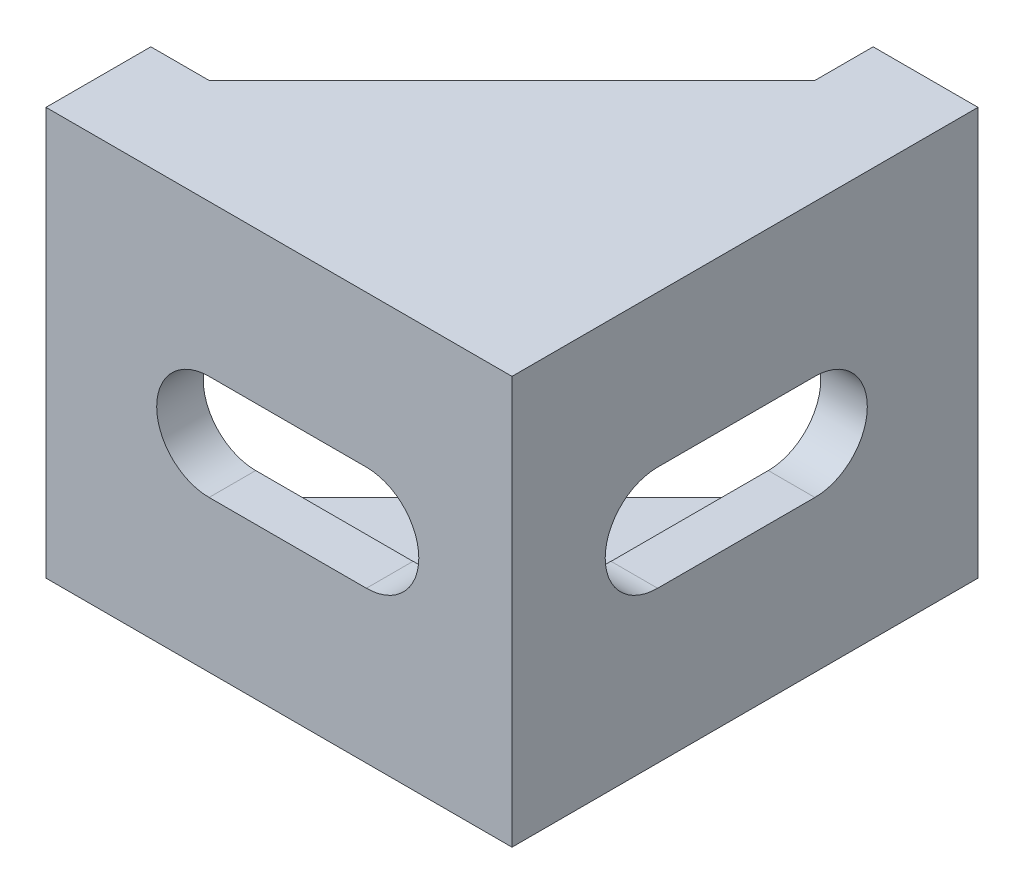
ISO-10303-21;
HEADER;
FILE_DESCRIPTION(('STEP AP214'),'2;1');
FILE_NAME('part.step','',(''),(''),'','','');
FILE_SCHEMA(('AUTOMOTIVE_DESIGN { 1 0 10303 214 1 1 1 1 }'));
ENDSEC;
DATA;
#1=APPLICATION_CONTEXT('core data for automotive mechanical design processes');
#2=APPLICATION_PROTOCOL_DEFINITION('international standard','automotive_design',2000,#1);
#3=PRODUCT_CONTEXT('',#1,'mechanical');
#4=PRODUCT('Part','Part','',(#3));
#5=PRODUCT_RELATED_PRODUCT_CATEGORY('part','',(#4));
#6=PRODUCT_DEFINITION_FORMATION('','',#4);
#7=PRODUCT_DEFINITION_CONTEXT('part definition',#1,'design');
#8=PRODUCT_DEFINITION('design','',#6,#7);
#9=PRODUCT_DEFINITION_SHAPE('','',#8);
#10=(LENGTH_UNIT() NAMED_UNIT(*) SI_UNIT(.MILLI.,.METRE.));
#11=(NAMED_UNIT(*) PLANE_ANGLE_UNIT() SI_UNIT($,.RADIAN.));
#12=(NAMED_UNIT(*) SI_UNIT($,.STERADIAN.) SOLID_ANGLE_UNIT());
#13=UNCERTAINTY_MEASURE_WITH_UNIT(LENGTH_MEASURE(1.E-05),#10,'distance_accuracy_value','');
#14=(GEOMETRIC_REPRESENTATION_CONTEXT(3) GLOBAL_UNCERTAINTY_ASSIGNED_CONTEXT((#13)) GLOBAL_UNIT_ASSIGNED_CONTEXT((#10,
#11,#12)) REPRESENTATION_CONTEXT('',''));
#15=CARTESIAN_POINT('',(0.,0.,0.));
#16=DIRECTION('',(0.,0.,1.));
#17=DIRECTION('',(1.,0.,0.));
#18=AXIS2_PLACEMENT_3D('',#15,#16,#17);
#19=CARTESIAN_POINT('',(-235.863957814071,1019.36661231007,1109.6333992583));
#20=DIRECTION('',(-1.,0.,0.));
#21=DIRECTION('',(0.,0.,-1.));
#22=AXIS2_PLACEMENT_3D('',#19,#20,#21);
#23=PLANE('',#22);
#24=DIRECTION('',(0.,0.,-1.));
#25=VECTOR('',#24,1.);
#26=CARTESIAN_POINT('',(-235.863957814071,1019.36661231007,1109.6333992583));
#27=LINE('',#26,#25);
#28=CARTESIAN_POINT('',(-235.863957814071,1019.36661231007,1109.6333992583));
#29=VERTEX_POINT('',#28);
#30=CARTESIAN_POINT('',(-235.863957814071,1019.36661231007,1089.6333992583));
#31=VERTEX_POINT('',#30);
#32=EDGE_CURVE('E320',#29,#31,#27,.T.);
#33=ORIENTED_EDGE('',*,*,#32,.F.);
#34=DIRECTION('',(0.,1.,0.));
#35=VECTOR('',#34,1.);
#36=CARTESIAN_POINT('',(-235.863957814071,1019.36661231007,1109.6333992583));
#37=LINE('',#36,#35);
#38=CARTESIAN_POINT('',(-235.863957814071,1001.86661231007,1109.6333992583));
#39=VERTEX_POINT('',#38);
#40=EDGE_CURVE('E61',#39,#29,#37,.T.);
#41=ORIENTED_EDGE('',*,*,#40,.F.);
#42=DIRECTION('',(0.,0.,1.));
#43=VECTOR('',#42,1.);
#44=CARTESIAN_POINT('',(-235.863957814071,1001.86661231007,1109.6333992583));
#45=LINE('',#44,#43);
#46=CARTESIAN_POINT('',(-235.863957814071,1001.86661231007,1089.6333992583));
#47=VERTEX_POINT('',#46);
#48=EDGE_CURVE('E331',#47,#39,#45,.T.);
#49=ORIENTED_EDGE('',*,*,#48,.F.);
#50=DIRECTION('',(0.,-1.,0.));
#51=VECTOR('',#50,1.);
#52=CARTESIAN_POINT('',(-235.863957814071,1019.36661231007,1089.6333992583));
#53=LINE('',#52,#51);
#54=EDGE_CURVE('E388',#31,#47,#53,.T.);
#55=ORIENTED_EDGE('',*,*,#54,.F.);
#56=EDGE_LOOP('',(#33,#41,#49,#55));
#57=FACE_BOUND('',#56,.T.);
#58=DIRECTION('',(0.,0.,1.));
#59=VECTOR('',#58,1.);
#60=CARTESIAN_POINT('',(-235.863957814071,1012.86661231007,1109.6333992583));
#61=LINE('',#60,#59);
#62=CARTESIAN_POINT('',(-235.863957814071,1012.86661231007,1096.6333992583));
#63=VERTEX_POINT('',#62);
#64=CARTESIAN_POINT('',(-235.863957814071,1012.86661231007,1103.3833992583));
#65=VERTEX_POINT('',#64);
#66=EDGE_CURVE('E48',#63,#65,#61,.T.);
#67=ORIENTED_EDGE('',*,*,#66,.F.);
#68=CARTESIAN_POINT('',(-235.863957814071,1010.61661231007,1096.6333992583));
#69=DIRECTION('',(1.,0.,0.));
#70=DIRECTION('',(0.,1.,0.));
#71=AXIS2_PLACEMENT_3D('',#68,#69,#70);
#72=CIRCLE('',#71,2.25);
#73=CARTESIAN_POINT('',(-235.863957814071,1008.36661231007,1096.6333992583));
#74=VERTEX_POINT('',#73);
#75=EDGE_CURVE('E373',#74,#63,#72,.T.);
#76=ORIENTED_EDGE('',*,*,#75,.F.);
#77=DIRECTION('',(0.,0.,-1.));
#78=VECTOR('',#77,1.);
#79=CARTESIAN_POINT('',(-235.863957814071,1008.36661231007,1109.6333992583));
#80=LINE('',#79,#78);
#81=CARTESIAN_POINT('',(-235.863957814071,1008.36661231007,1103.3833992583));
#82=VERTEX_POINT('',#81);
#83=EDGE_CURVE('E398',#82,#74,#80,.T.);
#84=ORIENTED_EDGE('',*,*,#83,.F.);
#85=CARTESIAN_POINT('',(-235.863957814071,1010.61661231007,1103.3833992583));
#86=DIRECTION('',(1.,0.,0.));
#87=DIRECTION('',(0.,1.,0.));
#88=AXIS2_PLACEMENT_3D('',#85,#86,#87);
#89=CIRCLE('',#88,2.25);
#90=EDGE_CURVE('E11',#65,#82,#89,.T.);
#91=ORIENTED_EDGE('',*,*,#90,.F.);
#92=EDGE_LOOP('',(#67,#76,#84,#91));
#93=FACE_BOUND('',#92,.T.);
#94=ADVANCED_FACE('F38',(#57,#93),#23,.F.);
#95=CARTESIAN_POINT('',(-219.863957814071,1010.61661231007,1103.3833992583));
#96=DIRECTION('',(-1.,0.,0.));
#97=DIRECTION('',(0.,1.,0.));
#98=AXIS2_PLACEMENT_3D('',#95,#96,#97);
#99=CYLINDRICAL_SURFACE('',#98,2.25);
#100=DIRECTION('',(-1.,0.,0.));
#101=VECTOR('',#100,1.);
#102=CARTESIAN_POINT('',(-219.863957814071,1012.86661231007,1103.3833992583));
#103=LINE('',#102,#101);
#104=CARTESIAN_POINT('',(-237.863957814071,1012.86661231007,1103.3833992583));
#105=VERTEX_POINT('',#104);
#106=EDGE_CURVE('E369',#65,#105,#103,.T.);
#107=ORIENTED_EDGE('',*,*,#106,.F.);
#108=ORIENTED_EDGE('',*,*,#90,.T.);
#109=DIRECTION('',(1.,0.,0.));
#110=VECTOR('',#109,1.);
#111=CARTESIAN_POINT('',(-219.863957814071,1008.36661231007,1103.3833992583));
#112=LINE('',#111,#110);
#113=CARTESIAN_POINT('',(-237.863957814071,1008.36661231007,1103.3833992583));
#114=VERTEX_POINT('',#113);
#115=EDGE_CURVE('E393',#114,#82,#112,.T.);
#116=ORIENTED_EDGE('',*,*,#115,.F.);
#117=CARTESIAN_POINT('',(-237.863957814071,1010.61661231007,1103.3833992583));
#118=DIRECTION('',(1.,0.,0.));
#119=DIRECTION('',(0.,1.,0.));
#120=AXIS2_PLACEMENT_3D('',#117,#118,#119);
#121=CIRCLE('',#120,2.25);
#122=EDGE_CURVE('E311',#105,#114,#121,.T.);
#123=ORIENTED_EDGE('',*,*,#122,.F.);
#124=EDGE_LOOP('',(#107,#108,#116,#123));
#125=FACE_BOUND('',#124,.T.);
#126=ADVANCED_FACE('F504',(#125),#99,.F.);
#127=CARTESIAN_POINT('',(-219.863957814071,1012.86661231007,1103.3833992583));
#128=DIRECTION('',(0.,1.,0.));
#129=DIRECTION('',(0.,0.,-1.));
#130=AXIS2_PLACEMENT_3D('',#127,#128,#129);
#131=PLANE('',#130);
#132=DIRECTION('',(-1.,0.,0.));
#133=VECTOR('',#132,1.);
#134=CARTESIAN_POINT('',(-219.863957814071,1012.86661231007,1096.6333992583));
#135=LINE('',#134,#133);
#136=CARTESIAN_POINT('',(-237.863957814071,1012.86661231007,1096.6333992583));
#137=VERTEX_POINT('',#136);
#138=EDGE_CURVE('E397',#63,#137,#135,.T.);
#139=ORIENTED_EDGE('',*,*,#138,.F.);
#140=ORIENTED_EDGE('',*,*,#66,.T.);
#141=ORIENTED_EDGE('',*,*,#106,.T.);
#142=DIRECTION('',(0.,0.,1.));
#143=VECTOR('',#142,1.);
#144=CARTESIAN_POINT('',(-237.863957814071,1012.86661231007,1103.3833992583));
#145=LINE('',#144,#143);
#146=EDGE_CURVE('E291',#137,#105,#145,.T.);
#147=ORIENTED_EDGE('',*,*,#146,.F.);
#148=EDGE_LOOP('',(#139,#140,#141,#147));
#149=FACE_BOUND('',#148,.T.);
#150=ADVANCED_FACE('F509',(#149),#131,.F.);
#151=CARTESIAN_POINT('',(-219.863957814071,1010.61661231007,1096.6333992583));
#152=DIRECTION('',(-1.,0.,0.));
#153=DIRECTION('',(0.,1.,0.));
#154=AXIS2_PLACEMENT_3D('',#151,#152,#153);
#155=CYLINDRICAL_SURFACE('',#154,2.25);
#156=DIRECTION('',(-1.,0.,0.));
#157=VECTOR('',#156,1.);
#158=CARTESIAN_POINT('',(-219.863957814071,1008.36661231007,1096.6333992583));
#159=LINE('',#158,#157);
#160=CARTESIAN_POINT('',(-237.863957814071,1008.36661231007,1096.6333992583));
#161=VERTEX_POINT('',#160);
#162=EDGE_CURVE('E392',#74,#161,#159,.T.);
#163=ORIENTED_EDGE('',*,*,#162,.F.);
#164=ORIENTED_EDGE('',*,*,#75,.T.);
#165=ORIENTED_EDGE('',*,*,#138,.T.);
#166=CARTESIAN_POINT('',(-237.863957814071,1010.61661231007,1096.6333992583));
#167=DIRECTION('',(1.,0.,0.));
#168=DIRECTION('',(0.,1.,0.));
#169=AXIS2_PLACEMENT_3D('',#166,#167,#168);
#170=CIRCLE('',#169,2.25);
#171=EDGE_CURVE('E41',#161,#137,#170,.T.);
#172=ORIENTED_EDGE('',*,*,#171,.F.);
#173=EDGE_LOOP('',(#163,#164,#165,#172));
#174=FACE_BOUND('',#173,.T.);
#175=ADVANCED_FACE('F524',(#174),#155,.F.);
#176=CARTESIAN_POINT('',(-219.863957814071,1008.36661231007,1103.3833992583));
#177=DIRECTION('',(0.,-1.,0.));
#178=DIRECTION('',(0.,0.,1.));
#179=AXIS2_PLACEMENT_3D('',#176,#177,#178);
#180=PLANE('',#179);
#181=ORIENTED_EDGE('',*,*,#115,.T.);
#182=ORIENTED_EDGE('',*,*,#83,.T.);
#183=ORIENTED_EDGE('',*,*,#162,.T.);
#184=DIRECTION('',(0.,0.,-1.));
#185=VECTOR('',#184,1.);
#186=CARTESIAN_POINT('',(-237.863957814071,1008.36661231007,1103.3833992583));
#187=LINE('',#186,#185);
#188=EDGE_CURVE('E344',#114,#161,#187,.T.);
#189=ORIENTED_EDGE('',*,*,#188,.F.);
#190=EDGE_LOOP('',(#181,#182,#183,#189));
#191=FACE_BOUND('',#190,.T.);
#192=ADVANCED_FACE('F549',(#191),#180,.F.);
#193=CARTESIAN_POINT('',(-240.363957814071,1019.36661231007,1089.6333992583));
#194=DIRECTION('',(0.,0.,1.));
#195=DIRECTION('',(0.,1.,0.));
#196=AXIS2_PLACEMENT_3D('',#193,#194,#195);
#197=PLANE('',#196);
#198=DIRECTION('',(0.,-1.,0.));
#199=VECTOR('',#198,1.);
#200=CARTESIAN_POINT('',(-237.863957814071,1019.36661231007,1089.6333992583));
#201=LINE('',#200,#199);
#202=CARTESIAN_POINT('',(-237.863957814071,1017.36661231007,1089.6333992583));
#203=VERTEX_POINT('',#202);
#204=CARTESIAN_POINT('',(-237.863957814071,1003.86661231007,1089.6333992583));
#205=VERTEX_POINT('',#204);
#206=EDGE_CURVE('E305',#203,#205,#201,.T.);
#207=ORIENTED_EDGE('',*,*,#206,.F.);
#208=DIRECTION('',(1.,0.,0.));
#209=VECTOR('',#208,1.);
#210=CARTESIAN_POINT('',(-240.363957814071,1017.36661231007,1089.6333992583));
#211=LINE('',#210,#209);
#212=CARTESIAN_POINT('',(-240.363957814071,1017.36661231007,1089.6333992583));
#213=VERTEX_POINT('',#212);
#214=EDGE_CURVE('E277',#213,#203,#211,.T.);
#215=ORIENTED_EDGE('',*,*,#214,.F.);
#216=DIRECTION('',(0.,-1.,0.));
#217=VECTOR('',#216,1.);
#218=CARTESIAN_POINT('',(-240.363957814071,1019.36661231007,1089.6333992583));
#219=LINE('',#218,#217);
#220=CARTESIAN_POINT('',(-240.363957814071,1019.36661231007,1089.6333992583));
#221=VERTEX_POINT('',#220);
#222=EDGE_CURVE('E282',#221,#213,#219,.T.);
#223=ORIENTED_EDGE('',*,*,#222,.F.);
#224=DIRECTION('',(-1.,0.,0.));
#225=VECTOR('',#224,1.);
#226=CARTESIAN_POINT('',(-240.363957814071,1019.36661231007,1089.6333992583));
#227=LINE('',#226,#225);
#228=EDGE_CURVE('E401',#31,#221,#227,.T.);
#229=ORIENTED_EDGE('',*,*,#228,.F.);
#230=ORIENTED_EDGE('',*,*,#54,.T.);
#231=DIRECTION('',(1.,0.,0.));
#232=VECTOR('',#231,1.);
#233=CARTESIAN_POINT('',(-240.363957814071,1001.86661231007,1089.6333992583));
#234=LINE('',#233,#232);
#235=CARTESIAN_POINT('',(-240.363957814071,1001.86661231007,1089.6333992583));
#236=VERTEX_POINT('',#235);
#237=EDGE_CURVE('E327',#236,#47,#234,.T.);
#238=ORIENTED_EDGE('',*,*,#237,.F.);
#239=DIRECTION('',(0.,-1.,0.));
#240=VECTOR('',#239,1.);
#241=CARTESIAN_POINT('',(-240.363957814071,1019.36661231007,1089.6333992583));
#242=LINE('',#241,#240);
#243=CARTESIAN_POINT('',(-240.363957814071,1003.86661231007,1089.6333992583));
#244=VERTEX_POINT('',#243);
#245=EDGE_CURVE('E332',#244,#236,#242,.T.);
#246=ORIENTED_EDGE('',*,*,#245,.F.);
#247=DIRECTION('',(-1.,0.,0.));
#248=VECTOR('',#247,1.);
#249=CARTESIAN_POINT('',(-240.363957814071,1003.86661231007,1089.6333992583));
#250=LINE('',#249,#248);
#251=EDGE_CURVE('E281',#205,#244,#250,.T.);
#252=ORIENTED_EDGE('',*,*,#251,.F.);
#253=EDGE_LOOP('',(#207,#215,#223,#229,#230,#238,#246,#252));
#254=FACE_BOUND('',#253,.T.);
#255=ADVANCED_FACE('F488',(#254),#197,.F.);
#256=CARTESIAN_POINT('',(-255.863957814071,1019.36661231007,1109.6333992583));
#257=DIRECTION('',(0.,1.,0.));
#258=DIRECTION('',(0.,0.,-1.));
#259=AXIS2_PLACEMENT_3D('',#256,#257,#258);
#260=PLANE('',#259);
#261=DIRECTION('',(0.,0.,1.));
#262=VECTOR('',#261,1.);
#263=CARTESIAN_POINT('',(-240.363957814071,1019.36661231007,1109.6333992583));
#264=LINE('',#263,#262);
#265=CARTESIAN_POINT('',(-240.363957814071,1019.36661231007,1092.1333992583));
#266=VERTEX_POINT('',#265);
#267=EDGE_CURVE('E299',#221,#266,#264,.T.);
#268=ORIENTED_EDGE('',*,*,#267,.T.);
#269=DIRECTION('',(-0.707106781186548,0.,0.707106781186548));
#270=VECTOR('',#269,1.);
#271=CARTESIAN_POINT('',(-240.363957814071,1019.36661231007,1092.1333992583));
#272=LINE('',#271,#270);
#273=CARTESIAN_POINT('',(-253.363957814071,1019.36661231007,1105.1333992583));
#274=VERTEX_POINT('',#273);
#275=EDGE_CURVE('E295',#266,#274,#272,.T.);
#276=ORIENTED_EDGE('',*,*,#275,.T.);
#277=DIRECTION('',(-1.,0.,0.));
#278=VECTOR('',#277,1.);
#279=CARTESIAN_POINT('',(-255.863957814071,1019.36661231007,1105.1333992583));
#280=LINE('',#279,#278);
#281=CARTESIAN_POINT('',(-255.863957814071,1019.36661231007,1105.1333992583));
#282=VERTEX_POINT('',#281);
#283=EDGE_CURVE('E300',#274,#282,#280,.T.);
#284=ORIENTED_EDGE('',*,*,#283,.T.);
#285=DIRECTION('',(0.,0.,1.));
#286=VECTOR('',#285,1.);
#287=CARTESIAN_POINT('',(-255.863957814071,1019.36661231007,1109.6333992583));
#288=LINE('',#287,#286);
#289=CARTESIAN_POINT('',(-255.863957814071,1019.36661231007,1109.6333992583));
#290=VERTEX_POINT('',#289);
#291=EDGE_CURVE('E319',#282,#290,#288,.T.);
#292=ORIENTED_EDGE('',*,*,#291,.T.);
#293=DIRECTION('',(1.,0.,0.));
#294=VECTOR('',#293,1.);
#295=CARTESIAN_POINT('',(-255.863957814071,1019.36661231007,1109.6333992583));
#296=LINE('',#295,#294);
#297=EDGE_CURVE('E315',#290,#29,#296,.T.);
#298=ORIENTED_EDGE('',*,*,#297,.T.);
#299=ORIENTED_EDGE('',*,*,#32,.T.);
#300=ORIENTED_EDGE('',*,*,#228,.T.);
#301=EDGE_LOOP('',(#268,#276,#284,#292,#298,#299,#300));
#302=FACE_BOUND('',#301,.T.);
#303=ADVANCED_FACE('F633',(#302),#260,.T.);
#304=CARTESIAN_POINT('',(-255.863957814071,1019.36661231007,1109.6333992583));
#305=DIRECTION('',(0.,0.,-1.));
#306=DIRECTION('',(-1.,0.,0.));
#307=AXIS2_PLACEMENT_3D('',#304,#305,#306);
#308=PLANE('',#307);
#309=ORIENTED_EDGE('',*,*,#297,.F.);
#310=DIRECTION('',(0.,1.,0.));
#311=VECTOR('',#310,1.);
#312=CARTESIAN_POINT('',(-255.863957814071,1019.36661231007,1109.6333992583));
#313=LINE('',#312,#311);
#314=CARTESIAN_POINT('',(-255.863957814071,1001.86661231007,1109.6333992583));
#315=VERTEX_POINT('',#314);
#316=EDGE_CURVE('E346',#315,#290,#313,.T.);
#317=ORIENTED_EDGE('',*,*,#316,.F.);
#318=DIRECTION('',(-1.,0.,0.));
#319=VECTOR('',#318,1.);
#320=CARTESIAN_POINT('',(-255.863957814071,1001.86661231007,1109.6333992583));
#321=LINE('',#320,#319);
#322=EDGE_CURVE('E364',#39,#315,#321,.T.);
#323=ORIENTED_EDGE('',*,*,#322,.F.);
#324=ORIENTED_EDGE('',*,*,#40,.T.);
#325=EDGE_LOOP('',(#309,#317,#323,#324));
#326=FACE_BOUND('',#325,.T.);
#327=DIRECTION('',(-1.,0.,0.));
#328=VECTOR('',#327,1.);
#329=CARTESIAN_POINT('',(-255.863957814071,1012.86661231007,1109.6333992583));
#330=LINE('',#329,#328);
#331=CARTESIAN_POINT('',(-242.113957814071,1012.86661231007,1109.6333992583));
#332=VERTEX_POINT('',#331);
#333=CARTESIAN_POINT('',(-248.863957814071,1012.86661231007,1109.6333992583));
#334=VERTEX_POINT('',#333);
#335=EDGE_CURVE('E355',#332,#334,#330,.T.);
#336=ORIENTED_EDGE('',*,*,#335,.F.);
#337=CARTESIAN_POINT('',(-242.113957814071,1010.61661231007,1109.6333992583));
#338=DIRECTION('',(0.,0.,1.));
#339=DIRECTION('',(0.,-1.,0.));
#340=AXIS2_PLACEMENT_3D('',#337,#338,#339);
#341=CIRCLE('',#340,2.25);
#342=CARTESIAN_POINT('',(-242.113957814071,1008.36661231007,1109.6333992583));
#343=VERTEX_POINT('',#342);
#344=EDGE_CURVE('E287',#343,#332,#341,.T.);
#345=ORIENTED_EDGE('',*,*,#344,.F.);
#346=DIRECTION('',(1.,0.,0.));
#347=VECTOR('',#346,1.);
#348=CARTESIAN_POINT('',(-255.863957814071,1008.36661231007,1109.6333992583));
#349=LINE('',#348,#347);
#350=CARTESIAN_POINT('',(-248.863957814071,1008.36661231007,1109.6333992583));
#351=VERTEX_POINT('',#350);
#352=EDGE_CURVE('E409',#351,#343,#349,.T.);
#353=ORIENTED_EDGE('',*,*,#352,.F.);
#354=CARTESIAN_POINT('',(-248.863957814071,1010.61661231007,1109.6333992583));
#355=DIRECTION('',(0.,0.,1.));
#356=DIRECTION('',(0.,-1.,0.));
#357=AXIS2_PLACEMENT_3D('',#354,#355,#356);
#358=CIRCLE('',#357,2.25);
#359=EDGE_CURVE('E351',#334,#351,#358,.T.);
#360=ORIENTED_EDGE('',*,*,#359,.F.);
#361=EDGE_LOOP('',(#336,#345,#353,#360));
#362=FACE_BOUND('',#361,.T.);
#363=ADVANCED_FACE('F601',(#326,#362),#308,.F.);
#364=CARTESIAN_POINT('',(-255.863957814071,1001.86661231007,1109.6333992583));
#365=DIRECTION('',(0.,1.,0.));
#366=DIRECTION('',(0.,0.,-1.));
#367=AXIS2_PLACEMENT_3D('',#364,#365,#366);
#368=PLANE('',#367);
#369=DIRECTION('',(-1.,0.,0.));
#370=VECTOR('',#369,1.);
#371=CARTESIAN_POINT('',(-255.863957814071,1001.86661231007,1105.1333992583));
#372=LINE('',#371,#370);
#373=CARTESIAN_POINT('',(-253.363957814071,1001.86661231007,1105.1333992583));
#374=VERTEX_POINT('',#373);
#375=CARTESIAN_POINT('',(-255.863957814071,1001.86661231007,1105.1333992583));
#376=VERTEX_POINT('',#375);
#377=EDGE_CURVE('E264',#374,#376,#372,.T.);
#378=ORIENTED_EDGE('',*,*,#377,.F.);
#379=DIRECTION('',(-0.707106781186547,0.,0.707106781186548));
#380=VECTOR('',#379,1.);
#381=CARTESIAN_POINT('',(-240.363957814071,1001.86661231007,1092.1333992583));
#382=LINE('',#381,#380);
#383=CARTESIAN_POINT('',(-240.363957814071,1001.86661231007,1092.1333992583));
#384=VERTEX_POINT('',#383);
#385=EDGE_CURVE('E276',#384,#374,#382,.T.);
#386=ORIENTED_EDGE('',*,*,#385,.F.);
#387=DIRECTION('',(0.,0.,1.));
#388=VECTOR('',#387,1.);
#389=CARTESIAN_POINT('',(-240.363957814071,1001.86661231007,1109.6333992583));
#390=LINE('',#389,#388);
#391=EDGE_CURVE('E325',#236,#384,#390,.T.);
#392=ORIENTED_EDGE('',*,*,#391,.F.);
#393=ORIENTED_EDGE('',*,*,#237,.T.);
#394=ORIENTED_EDGE('',*,*,#48,.T.);
#395=ORIENTED_EDGE('',*,*,#322,.T.);
#396=DIRECTION('',(0.,0.,1.));
#397=VECTOR('',#396,1.);
#398=CARTESIAN_POINT('',(-255.863957814071,1001.86661231007,1109.6333992583));
#399=LINE('',#398,#397);
#400=EDGE_CURVE('E405',#376,#315,#399,.T.);
#401=ORIENTED_EDGE('',*,*,#400,.F.);
#402=EDGE_LOOP('',(#378,#386,#392,#393,#394,#395,#401));
#403=FACE_BOUND('',#402,.T.);
#404=ADVANCED_FACE('F562',(#403),#368,.F.);
#405=CARTESIAN_POINT('',(-237.863957814071,1001.86661231007,1109.6333992583));
#406=DIRECTION('',(-1.,0.,0.));
#407=DIRECTION('',(0.,0.,-1.));
#408=AXIS2_PLACEMENT_3D('',#405,#406,#407);
#409=PLANE('',#408);
#410=ORIENTED_EDGE('',*,*,#206,.T.);
#411=DIRECTION('',(0.,0.,1.));
#412=VECTOR('',#411,1.);
#413=CARTESIAN_POINT('',(-237.863957814071,1003.86661231007,1109.6333992583));
#414=LINE('',#413,#412);
#415=CARTESIAN_POINT('',(-237.863957814071,1003.86661231007,1107.6333992583));
#416=VERTEX_POINT('',#415);
#417=EDGE_CURVE('E301',#205,#416,#414,.T.);
#418=ORIENTED_EDGE('',*,*,#417,.T.);
#419=DIRECTION('',(0.,1.,0.));
#420=VECTOR('',#419,1.);
#421=CARTESIAN_POINT('',(-237.863957814071,1001.86661231007,1107.6333992583));
#422=LINE('',#421,#420);
#423=CARTESIAN_POINT('',(-237.863957814071,1017.36661231007,1107.6333992583));
#424=VERTEX_POINT('',#423);
#425=EDGE_CURVE('E306',#416,#424,#422,.T.);
#426=ORIENTED_EDGE('',*,*,#425,.T.);
#427=DIRECTION('',(0.,0.,-1.));
#428=VECTOR('',#427,1.);
#429=CARTESIAN_POINT('',(-237.863957814071,1017.36661231007,1109.6333992583));
#430=LINE('',#429,#428);
#431=EDGE_CURVE('E307',#424,#203,#430,.T.);
#432=ORIENTED_EDGE('',*,*,#431,.T.);
#433=EDGE_LOOP('',(#410,#418,#426,#432));
#434=FACE_BOUND('',#433,.T.);
#435=ORIENTED_EDGE('',*,*,#122,.T.);
#436=ORIENTED_EDGE('',*,*,#188,.T.);
#437=ORIENTED_EDGE('',*,*,#171,.T.);
#438=ORIENTED_EDGE('',*,*,#146,.T.);
#439=EDGE_LOOP('',(#435,#436,#437,#438));
#440=FACE_BOUND('',#439,.T.);
#441=ADVANCED_FACE('F499',(#434,#440),#409,.T.);
#442=CARTESIAN_POINT('',(-237.863957814071,1003.86661231007,1107.6333992583));
#443=DIRECTION('',(0.,-1.,0.));
#444=DIRECTION('',(1.,0.,0.));
#445=AXIS2_PLACEMENT_3D('',#442,#443,#444);
#446=PLANE('',#445);
#447=DIRECTION('',(1.,0.,0.));
#448=VECTOR('',#447,1.);
#449=CARTESIAN_POINT('',(-237.863957814071,1003.86661231007,1105.1333992583));
#450=LINE('',#449,#448);
#451=CARTESIAN_POINT('',(-255.863957814071,1003.86661231007,1105.1333992583));
#452=VERTEX_POINT('',#451);
#453=CARTESIAN_POINT('',(-253.363957814071,1003.86661231007,1105.1333992583));
#454=VERTEX_POINT('',#453);
#455=EDGE_CURVE('E237',#452,#454,#450,.T.);
#456=ORIENTED_EDGE('',*,*,#455,.F.);
#457=DIRECTION('',(0.,0.,-1.));
#458=VECTOR('',#457,1.);
#459=CARTESIAN_POINT('',(-255.863957814071,1003.86661231007,1107.6333992583));
#460=LINE('',#459,#458);
#461=CARTESIAN_POINT('',(-255.863957814071,1003.86661231007,1107.6333992583));
#462=VERTEX_POINT('',#461);
#463=EDGE_CURVE('E240',#462,#452,#460,.T.);
#464=ORIENTED_EDGE('',*,*,#463,.F.);
#465=DIRECTION('',(-1.,0.,0.));
#466=VECTOR('',#465,1.);
#467=CARTESIAN_POINT('',(-237.863957814071,1003.86661231007,1107.6333992583));
#468=LINE('',#467,#466);
#469=EDGE_CURVE('E231',#416,#462,#468,.T.);
#470=ORIENTED_EDGE('',*,*,#469,.F.);
#471=ORIENTED_EDGE('',*,*,#417,.F.);
#472=ORIENTED_EDGE('',*,*,#251,.T.);
#473=DIRECTION('',(0.,0.,-1.));
#474=VECTOR('',#473,1.);
#475=CARTESIAN_POINT('',(-240.363957814071,1003.86661231007,1107.6333992583));
#476=LINE('',#475,#474);
#477=CARTESIAN_POINT('',(-240.363957814071,1003.86661231007,1092.1333992583));
#478=VERTEX_POINT('',#477);
#479=EDGE_CURVE('E321',#478,#244,#476,.T.);
#480=ORIENTED_EDGE('',*,*,#479,.F.);
#481=DIRECTION('',(0.707106781186547,0.,-0.707106781186548));
#482=VECTOR('',#481,1.);
#483=CARTESIAN_POINT('',(-253.363957814071,1003.86661231007,1105.1333992583));
#484=LINE('',#483,#482);
#485=EDGE_CURVE('E243',#454,#478,#484,.T.);
#486=ORIENTED_EDGE('',*,*,#485,.F.);
#487=EDGE_LOOP('',(#456,#464,#470,#471,#472,#480,#486));
#488=FACE_BOUND('',#487,.T.);
#489=ADVANCED_FACE('F239',(#488),#446,.F.);
#490=CARTESIAN_POINT('',(-237.863957814071,1017.36661231007,1107.6333992583));
#491=DIRECTION('',(0.,1.,0.));
#492=DIRECTION('',(0.,0.,-1.));
#493=AXIS2_PLACEMENT_3D('',#490,#491,#492);
#494=PLANE('',#493);
#495=DIRECTION('',(0.,0.,1.));
#496=VECTOR('',#495,1.);
#497=CARTESIAN_POINT('',(-255.863957814071,1017.36661231007,1107.6333992583));
#498=LINE('',#497,#496);
#499=CARTESIAN_POINT('',(-255.863957814071,1017.36661231007,1105.1333992583));
#500=VERTEX_POINT('',#499);
#501=CARTESIAN_POINT('',(-255.863957814071,1017.36661231007,1107.6333992583));
#502=VERTEX_POINT('',#501);
#503=EDGE_CURVE('E259',#500,#502,#498,.T.);
#504=ORIENTED_EDGE('',*,*,#503,.F.);
#505=DIRECTION('',(-1.,0.,0.));
#506=VECTOR('',#505,1.);
#507=CARTESIAN_POINT('',(-237.863957814071,1017.36661231007,1105.1333992583));
#508=LINE('',#507,#506);
#509=CARTESIAN_POINT('',(-253.363957814071,1017.36661231007,1105.1333992583));
#510=VERTEX_POINT('',#509);
#511=EDGE_CURVE('E211',#510,#500,#508,.T.);
#512=ORIENTED_EDGE('',*,*,#511,.F.);
#513=DIRECTION('',(-0.707106781186547,0.,0.707106781186548));
#514=VECTOR('',#513,1.);
#515=CARTESIAN_POINT('',(-240.363957814071,1017.36661231007,1092.1333992583));
#516=LINE('',#515,#514);
#517=CARTESIAN_POINT('',(-240.363957814071,1017.36661231007,1092.1333992583));
#518=VERTEX_POINT('',#517);
#519=EDGE_CURVE('E219',#518,#510,#516,.T.);
#520=ORIENTED_EDGE('',*,*,#519,.F.);
#521=DIRECTION('',(0.,0.,1.));
#522=VECTOR('',#521,1.);
#523=CARTESIAN_POINT('',(-240.363957814071,1017.36661231007,1107.6333992583));
#524=LINE('',#523,#522);
#525=EDGE_CURVE('E335',#213,#518,#524,.T.);
#526=ORIENTED_EDGE('',*,*,#525,.F.);
#527=ORIENTED_EDGE('',*,*,#214,.T.);
#528=ORIENTED_EDGE('',*,*,#431,.F.);
#529=DIRECTION('',(1.,0.,0.));
#530=VECTOR('',#529,1.);
#531=CARTESIAN_POINT('',(-237.863957814071,1017.36661231007,1107.6333992583));
#532=LINE('',#531,#530);
#533=EDGE_CURVE('E374',#502,#424,#532,.T.);
#534=ORIENTED_EDGE('',*,*,#533,.F.);
#535=EDGE_LOOP('',(#504,#512,#520,#526,#527,#528,#534));
#536=FACE_BOUND('',#535,.T.);
#537=ADVANCED_FACE('F489',(#536),#494,.F.);
#538=CARTESIAN_POINT('',(-240.363957814071,1019.36661231007,1089.6333992583));
#539=DIRECTION('',(1.,0.,0.));
#540=DIRECTION('',(0.,-1.,0.));
#541=AXIS2_PLACEMENT_3D('',#538,#539,#540);
#542=PLANE('',#541);
#543=DIRECTION('',(0.,-1.,0.));
#544=VECTOR('',#543,1.);
#545=CARTESIAN_POINT('',(-240.363957814071,1019.36661231007,1092.1333992583));
#546=LINE('',#545,#544);
#547=EDGE_CURVE('E326',#266,#518,#546,.T.);
#548=ORIENTED_EDGE('',*,*,#547,.F.);
#549=ORIENTED_EDGE('',*,*,#267,.F.);
#550=ORIENTED_EDGE('',*,*,#222,.T.);
#551=ORIENTED_EDGE('',*,*,#525,.T.);
#552=EDGE_LOOP('',(#548,#549,#550,#551));
#553=FACE_BOUND('',#552,.T.);
#554=ADVANCED_FACE('F484',(#553),#542,.F.);
#555=CARTESIAN_POINT('',(-240.363957814071,1019.36661231007,1089.6333992583));
#556=DIRECTION('',(1.,0.,0.));
#557=DIRECTION('',(0.,-1.,0.));
#558=AXIS2_PLACEMENT_3D('',#555,#556,#557);
#559=PLANE('',#558);
#560=ORIENTED_EDGE('',*,*,#245,.T.);
#561=ORIENTED_EDGE('',*,*,#391,.T.);
#562=DIRECTION('',(0.,-1.,0.));
#563=VECTOR('',#562,1.);
#564=CARTESIAN_POINT('',(-240.363957814071,1019.36661231007,1092.1333992583));
#565=LINE('',#564,#563);
#566=EDGE_CURVE('E250',#478,#384,#565,.T.);
#567=ORIENTED_EDGE('',*,*,#566,.F.);
#568=ORIENTED_EDGE('',*,*,#479,.T.);
#569=EDGE_LOOP('',(#560,#561,#567,#568));
#570=FACE_BOUND('',#569,.T.);
#571=ADVANCED_FACE('F497',(#570),#559,.F.);
#572=CARTESIAN_POINT('',(-253.363957814071,1019.36661231007,1105.1333992583));
#573=DIRECTION('',(0.707106781186548,0.,0.707106781186547));
#574=DIRECTION('',(-0.707106781186547,0.,0.707106781186548));
#575=AXIS2_PLACEMENT_3D('',#572,#573,#574);
#576=PLANE('',#575);
#577=DIRECTION('',(0.,-1.,0.));
#578=VECTOR('',#577,1.);
#579=CARTESIAN_POINT('',(-253.363957814071,1019.36661231007,1105.1333992583));
#580=LINE('',#579,#578);
#581=EDGE_CURVE('E365',#274,#510,#580,.T.);
#582=ORIENTED_EDGE('',*,*,#581,.F.);
#583=ORIENTED_EDGE('',*,*,#275,.F.);
#584=ORIENTED_EDGE('',*,*,#547,.T.);
#585=ORIENTED_EDGE('',*,*,#519,.T.);
#586=EDGE_LOOP('',(#582,#583,#584,#585));
#587=FACE_BOUND('',#586,.T.);
#588=ADVANCED_FACE('F592',(#587),#576,.F.);
#589=CARTESIAN_POINT('',(-255.863957814071,1019.36661231007,1109.6333992583));
#590=DIRECTION('',(1.,0.,0.));
#591=DIRECTION('',(0.,-1.,0.));
#592=AXIS2_PLACEMENT_3D('',#589,#590,#591);
#593=PLANE('',#592);
#594=DIRECTION('',(0.,1.,0.));
#595=VECTOR('',#594,1.);
#596=CARTESIAN_POINT('',(-255.863957814071,1019.36661231007,1105.1333992583));
#597=LINE('',#596,#595);
#598=EDGE_CURVE('E249',#376,#452,#597,.T.);
#599=ORIENTED_EDGE('',*,*,#598,.F.);
#600=ORIENTED_EDGE('',*,*,#400,.T.);
#601=ORIENTED_EDGE('',*,*,#316,.T.);
#602=ORIENTED_EDGE('',*,*,#291,.F.);
#603=DIRECTION('',(0.,1.,0.));
#604=VECTOR('',#603,1.);
#605=CARTESIAN_POINT('',(-255.863957814071,1019.36661231007,1105.1333992583));
#606=LINE('',#605,#604);
#607=EDGE_CURVE('E260',#500,#282,#606,.T.);
#608=ORIENTED_EDGE('',*,*,#607,.F.);
#609=ORIENTED_EDGE('',*,*,#503,.T.);
#610=DIRECTION('',(0.,1.,0.));
#611=VECTOR('',#610,1.);
#612=CARTESIAN_POINT('',(-255.863957814071,1019.36661231007,1107.6333992583));
#613=LINE('',#612,#611);
#614=EDGE_CURVE('E257',#462,#502,#613,.T.);
#615=ORIENTED_EDGE('',*,*,#614,.F.);
#616=ORIENTED_EDGE('',*,*,#463,.T.);
#617=EDGE_LOOP('',(#599,#600,#601,#602,#608,#609,#615,#616));
#618=FACE_BOUND('',#617,.T.);
#619=ADVANCED_FACE('F254',(#618),#593,.F.);
#620=CARTESIAN_POINT('',(-255.863957814071,1019.36661231007,1105.1333992583));
#621=DIRECTION('',(0.,0.,1.));
#622=DIRECTION('',(-1.,0.,0.));
#623=AXIS2_PLACEMENT_3D('',#620,#621,#622);
#624=PLANE('',#623);
#625=ORIENTED_EDGE('',*,*,#607,.T.);
#626=ORIENTED_EDGE('',*,*,#283,.F.);
#627=ORIENTED_EDGE('',*,*,#581,.T.);
#628=ORIENTED_EDGE('',*,*,#511,.T.);
#629=EDGE_LOOP('',(#625,#626,#627,#628));
#630=FACE_BOUND('',#629,.T.);
#631=ADVANCED_FACE('F591',(#630),#624,.F.);
#632=CARTESIAN_POINT('',(-248.863957814071,1010.61661231007,1125.6333992583));
#633=DIRECTION('',(0.,0.,-1.));
#634=DIRECTION('',(0.,-1.,0.));
#635=AXIS2_PLACEMENT_3D('',#632,#633,#634);
#636=CYLINDRICAL_SURFACE('',#635,2.25);
#637=DIRECTION('',(0.,0.,-1.));
#638=VECTOR('',#637,1.);
#639=CARTESIAN_POINT('',(-248.863957814071,1012.86661231007,1125.6333992583));
#640=LINE('',#639,#638);
#641=CARTESIAN_POINT('',(-248.863957814071,1012.86661231007,1107.6333992583));
#642=VERTEX_POINT('',#641);
#643=EDGE_CURVE('E381',#334,#642,#640,.T.);
#644=ORIENTED_EDGE('',*,*,#643,.F.);
#645=ORIENTED_EDGE('',*,*,#359,.T.);
#646=DIRECTION('',(0.,0.,1.));
#647=VECTOR('',#646,1.);
#648=CARTESIAN_POINT('',(-248.863957814071,1008.36661231007,1125.6333992583));
#649=LINE('',#648,#647);
#650=CARTESIAN_POINT('',(-248.863957814071,1008.36661231007,1107.6333992583));
#651=VERTEX_POINT('',#650);
#652=EDGE_CURVE('E288',#651,#351,#649,.T.);
#653=ORIENTED_EDGE('',*,*,#652,.F.);
#654=CARTESIAN_POINT('',(-248.863957814071,1010.61661231007,1107.6333992583));
#655=DIRECTION('',(0.,0.,1.));
#656=DIRECTION('',(0.,-1.,0.));
#657=AXIS2_PLACEMENT_3D('',#654,#655,#656);
#658=CIRCLE('',#657,2.25);
#659=EDGE_CURVE('E358',#642,#651,#658,.T.);
#660=ORIENTED_EDGE('',*,*,#659,.F.);
#661=EDGE_LOOP('',(#644,#645,#653,#660));
#662=FACE_BOUND('',#661,.T.);
#663=ADVANCED_FACE('F623',(#662),#636,.F.);
#664=CARTESIAN_POINT('',(-248.863957814071,1012.86661231007,1125.6333992583));
#665=DIRECTION('',(0.,1.,0.));
#666=DIRECTION('',(0.,0.,-1.));
#667=AXIS2_PLACEMENT_3D('',#664,#665,#666);
#668=PLANE('',#667);
#669=DIRECTION('',(0.,0.,-1.));
#670=VECTOR('',#669,1.);
#671=CARTESIAN_POINT('',(-242.113957814071,1012.86661231007,1125.6333992583));
#672=LINE('',#671,#670);
#673=CARTESIAN_POINT('',(-242.113957814071,1012.86661231007,1107.6333992583));
#674=VERTEX_POINT('',#673);
#675=EDGE_CURVE('E283',#332,#674,#672,.T.);
#676=ORIENTED_EDGE('',*,*,#675,.F.);
#677=ORIENTED_EDGE('',*,*,#335,.T.);
#678=ORIENTED_EDGE('',*,*,#643,.T.);
#679=DIRECTION('',(-1.,0.,0.));
#680=VECTOR('',#679,1.);
#681=CARTESIAN_POINT('',(-248.863957814071,1012.86661231007,1107.6333992583));
#682=LINE('',#681,#680);
#683=EDGE_CURVE('E361',#674,#642,#682,.T.);
#684=ORIENTED_EDGE('',*,*,#683,.F.);
#685=EDGE_LOOP('',(#676,#677,#678,#684));
#686=FACE_BOUND('',#685,.T.);
#687=ADVANCED_FACE('F613',(#686),#668,.F.);
#688=CARTESIAN_POINT('',(-242.113957814071,1010.61661231007,1125.6333992583));
#689=DIRECTION('',(0.,0.,-1.));
#690=DIRECTION('',(0.,-1.,0.));
#691=AXIS2_PLACEMENT_3D('',#688,#689,#690);
#692=CYLINDRICAL_SURFACE('',#691,2.25);
#693=DIRECTION('',(0.,0.,-1.));
#694=VECTOR('',#693,1.);
#695=CARTESIAN_POINT('',(-242.113957814071,1008.36661231007,1125.6333992583));
#696=LINE('',#695,#694);
#697=CARTESIAN_POINT('',(-242.113957814071,1008.36661231007,1107.6333992583));
#698=VERTEX_POINT('',#697);
#699=EDGE_CURVE('E271',#343,#698,#696,.T.);
#700=ORIENTED_EDGE('',*,*,#699,.F.);
#701=ORIENTED_EDGE('',*,*,#344,.T.);
#702=ORIENTED_EDGE('',*,*,#675,.T.);
#703=CARTESIAN_POINT('',(-242.113957814071,1010.61661231007,1107.6333992583));
#704=DIRECTION('',(0.,0.,1.));
#705=DIRECTION('',(0.,-1.,0.));
#706=AXIS2_PLACEMENT_3D('',#703,#704,#705);
#707=CIRCLE('',#706,2.25);
#708=EDGE_CURVE('E425',#698,#674,#707,.T.);
#709=ORIENTED_EDGE('',*,*,#708,.F.);
#710=EDGE_LOOP('',(#700,#701,#702,#709));
#711=FACE_BOUND('',#710,.T.);
#712=ADVANCED_FACE('F608',(#711),#692,.F.);
#713=CARTESIAN_POINT('',(-248.863957814071,1008.36661231007,1125.6333992583));
#714=DIRECTION('',(0.,-1.,0.));
#715=DIRECTION('',(0.,0.,1.));
#716=AXIS2_PLACEMENT_3D('',#713,#714,#715);
#717=PLANE('',#716);
#718=ORIENTED_EDGE('',*,*,#652,.T.);
#719=ORIENTED_EDGE('',*,*,#352,.T.);
#720=ORIENTED_EDGE('',*,*,#699,.T.);
#721=DIRECTION('',(1.,0.,0.));
#722=VECTOR('',#721,1.);
#723=CARTESIAN_POINT('',(-248.863957814071,1008.36661231007,1107.6333992583));
#724=LINE('',#723,#722);
#725=EDGE_CURVE('E378',#651,#698,#724,.T.);
#726=ORIENTED_EDGE('',*,*,#725,.F.);
#727=EDGE_LOOP('',(#718,#719,#720,#726));
#728=FACE_BOUND('',#727,.T.);
#729=ADVANCED_FACE('F612',(#728),#717,.F.);
#730=CARTESIAN_POINT('',(-255.863957814071,1019.36661231007,1105.1333992583));
#731=DIRECTION('',(0.,0.,1.));
#732=DIRECTION('',(-1.,0.,0.));
#733=AXIS2_PLACEMENT_3D('',#730,#731,#732);
#734=PLANE('',#733);
#735=DIRECTION('',(0.,1.,0.));
#736=VECTOR('',#735,1.);
#737=CARTESIAN_POINT('',(-253.363957814071,1019.36661231007,1105.1333992583));
#738=LINE('',#737,#736);
#739=EDGE_CURVE('E274',#374,#454,#738,.T.);
#740=ORIENTED_EDGE('',*,*,#739,.F.);
#741=ORIENTED_EDGE('',*,*,#377,.T.);
#742=ORIENTED_EDGE('',*,*,#598,.T.);
#743=ORIENTED_EDGE('',*,*,#455,.T.);
#744=EDGE_LOOP('',(#740,#741,#742,#743));
#745=FACE_BOUND('',#744,.T.);
#746=ADVANCED_FACE('F262',(#745),#734,.F.);
#747=CARTESIAN_POINT('',(-253.363957814071,1019.36661231007,1105.1333992583));
#748=DIRECTION('',(0.707106781186548,0.,0.707106781186547));
#749=DIRECTION('',(-0.707106781186547,0.,0.707106781186548));
#750=AXIS2_PLACEMENT_3D('',#747,#748,#749);
#751=PLANE('',#750);
#752=ORIENTED_EDGE('',*,*,#566,.T.);
#753=ORIENTED_EDGE('',*,*,#385,.T.);
#754=ORIENTED_EDGE('',*,*,#739,.T.);
#755=ORIENTED_EDGE('',*,*,#485,.T.);
#756=EDGE_LOOP('',(#752,#753,#754,#755));
#757=FACE_BOUND('',#756,.T.);
#758=ADVANCED_FACE('F569',(#757),#751,.F.);
#759=CARTESIAN_POINT('',(-237.863957814071,1003.86661231007,1107.6333992583));
#760=DIRECTION('',(0.,0.,1.));
#761=DIRECTION('',(-1.,0.,0.));
#762=AXIS2_PLACEMENT_3D('',#759,#760,#761);
#763=PLANE('',#762);
#764=ORIENTED_EDGE('',*,*,#425,.F.);
#765=ORIENTED_EDGE('',*,*,#469,.T.);
#766=ORIENTED_EDGE('',*,*,#614,.T.);
#767=ORIENTED_EDGE('',*,*,#533,.T.);
#768=EDGE_LOOP('',(#764,#765,#766,#767));
#769=FACE_BOUND('',#768,.T.);
#770=ORIENTED_EDGE('',*,*,#725,.T.);
#771=ORIENTED_EDGE('',*,*,#708,.T.);
#772=ORIENTED_EDGE('',*,*,#683,.T.);
#773=ORIENTED_EDGE('',*,*,#659,.T.);
#774=EDGE_LOOP('',(#770,#771,#772,#773));
#775=FACE_BOUND('',#774,.T.);
#776=ADVANCED_FACE('F573',(#769,#775),#763,.F.);
#777=CLOSED_SHELL('',(#94,#126,#150,#175,#192,#255,#303,#363,#404,#441,#489,#537,#554,#571,#588,
#619,#631,#663,#687,#712,#729,#746,#758,#776));
#778=MANIFOLD_SOLID_BREP('B2',#777);
#779=ADVANCED_BREP_SHAPE_REPRESENTATION('',(#18,#778),#14);
#780=SHAPE_DEFINITION_REPRESENTATION(#9,#779);
ENDSEC;
END-ISO-10303-21;
